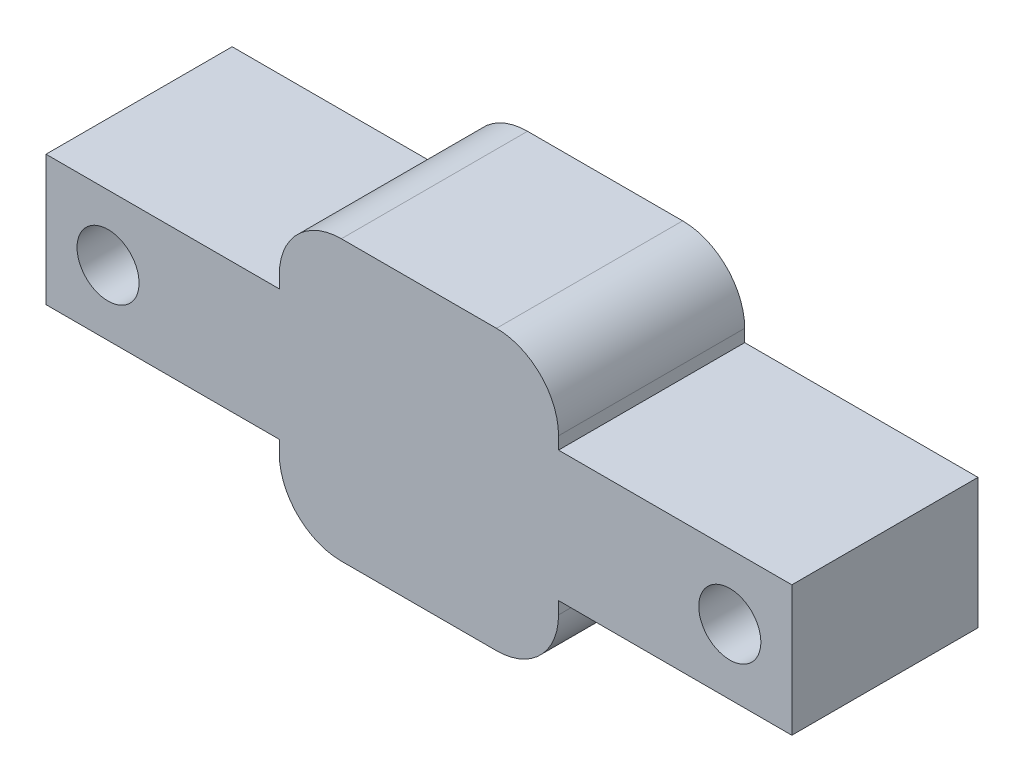
ISO-10303-21;
HEADER;
FILE_DESCRIPTION(('STEP AP214'),'2;1');
FILE_NAME('part.step','',(''),(''),'','','');
FILE_SCHEMA(('AUTOMOTIVE_DESIGN { 1 0 10303 214 1 1 1 1 }'));
ENDSEC;
DATA;
#1=APPLICATION_CONTEXT('core data for automotive mechanical design processes');
#2=APPLICATION_PROTOCOL_DEFINITION('international standard','automotive_design',2000,#1);
#3=PRODUCT_CONTEXT('',#1,'mechanical');
#4=PRODUCT('Part','Part','',(#3));
#5=PRODUCT_RELATED_PRODUCT_CATEGORY('part','',(#4));
#6=PRODUCT_DEFINITION_FORMATION('','',#4);
#7=PRODUCT_DEFINITION_CONTEXT('part definition',#1,'design');
#8=PRODUCT_DEFINITION('design','',#6,#7);
#9=PRODUCT_DEFINITION_SHAPE('','',#8);
#10=(LENGTH_UNIT() NAMED_UNIT(*) SI_UNIT(.MILLI.,.METRE.));
#11=(NAMED_UNIT(*) PLANE_ANGLE_UNIT() SI_UNIT($,.RADIAN.));
#12=(NAMED_UNIT(*) SI_UNIT($,.STERADIAN.) SOLID_ANGLE_UNIT());
#13=UNCERTAINTY_MEASURE_WITH_UNIT(LENGTH_MEASURE(1.E-05),#10,'distance_accuracy_value','');
#14=(GEOMETRIC_REPRESENTATION_CONTEXT(3) GLOBAL_UNCERTAINTY_ASSIGNED_CONTEXT((#13)) GLOBAL_UNIT_ASSIGNED_CONTEXT((#10,
#11,#12)) REPRESENTATION_CONTEXT('',''));
#15=CARTESIAN_POINT('',(0.,0.,0.));
#16=DIRECTION('',(0.,0.,1.));
#17=DIRECTION('',(1.,0.,0.));
#18=AXIS2_PLACEMENT_3D('',#15,#16,#17);
#19=CARTESIAN_POINT('',(-31.8135,0.,19.05));
#20=DIRECTION('',(0.,0.,-1.));
#21=DIRECTION('',(-1.,0.,0.));
#22=AXIS2_PLACEMENT_3D('',#19,#20,#21);
#23=CYLINDRICAL_SURFACE('',#22,3.17500000000001);
#24=CARTESIAN_POINT('',(-31.8135,0.,19.05));
#25=DIRECTION('',(0.,0.,1.));
#26=DIRECTION('',(1.,0.,0.));
#27=AXIS2_PLACEMENT_3D('',#24,#25,#26);
#28=CIRCLE('',#27,3.17500000000001);
#29=CARTESIAN_POINT('',(-34.9885,0.,19.05));
#30=VERTEX_POINT('',#29);
#31=EDGE_CURVE('E194',#30,#30,#28,.T.);
#32=CARTESIAN_POINT('',(-31.8135,0.,6.35));
#33=DIRECTION('',(0.,0.,-1.));
#34=DIRECTION('',(-1.,0.,0.));
#35=AXIS2_PLACEMENT_3D('',#32,#33,#34);
#36=CIRCLE('',#35,3.17500000000001);
#37=CARTESIAN_POINT('',(-34.9885,0.,6.35));
#38=VERTEX_POINT('',#37);
#39=EDGE_CURVE('E43',#38,#38,#36,.T.);
#40=CARTESIAN_POINT('',(-34.9885,0.,19.05));
#41=CARTESIAN_POINT('',(-34.9885,0.,18.9177083333333));
#42=CARTESIAN_POINT('',(-34.9885,0.,18.7854166666667));
#43=CARTESIAN_POINT('',(-34.9885,0.,18.5208333333333));
#44=CARTESIAN_POINT('',(-34.9885,0.,18.3885416666667));
#45=CARTESIAN_POINT('',(-34.9885,0.,18.1239583333333));
#46=CARTESIAN_POINT('',(-34.9885,0.,17.9916666666667));
#47=CARTESIAN_POINT('',(-34.9885,0.,17.7270833333333));
#48=CARTESIAN_POINT('',(-34.9885,0.,17.5947916666667));
#49=CARTESIAN_POINT('',(-34.9885,0.,17.3302083333333));
#50=CARTESIAN_POINT('',(-34.9885,0.,17.1979166666667));
#51=CARTESIAN_POINT('',(-34.9885,0.,16.9333333333333));
#52=CARTESIAN_POINT('',(-34.9885,0.,16.8010416666667));
#53=CARTESIAN_POINT('',(-34.9885,0.,16.5364583333333));
#54=CARTESIAN_POINT('',(-34.9885,0.,16.4041666666667));
#55=CARTESIAN_POINT('',(-34.9885,0.,16.1395833333333));
#56=CARTESIAN_POINT('',(-34.9885,0.,16.0072916666667));
#57=CARTESIAN_POINT('',(-34.9885,0.,15.7427083333333));
#58=CARTESIAN_POINT('',(-34.9885,0.,15.6104166666667));
#59=CARTESIAN_POINT('',(-34.9885,0.,15.3458333333333));
#60=CARTESIAN_POINT('',(-34.9885,0.,15.2135416666667));
#61=CARTESIAN_POINT('',(-34.9885,0.,14.9489583333333));
#62=CARTESIAN_POINT('',(-34.9885,0.,14.8166666666667));
#63=CARTESIAN_POINT('',(-34.9885,0.,14.5520833333333));
#64=CARTESIAN_POINT('',(-34.9885,0.,14.4197916666667));
#65=CARTESIAN_POINT('',(-34.9885,0.,14.1552083333333));
#66=CARTESIAN_POINT('',(-34.9885,0.,14.0229166666667));
#67=CARTESIAN_POINT('',(-34.9885,0.,13.7583333333333));
#68=CARTESIAN_POINT('',(-34.9885,0.,13.6260416666667));
#69=CARTESIAN_POINT('',(-34.9885,0.,13.3614583333333));
#70=CARTESIAN_POINT('',(-34.9885,0.,13.2291666666667));
#71=CARTESIAN_POINT('',(-34.9885,0.,12.9645833333333));
#72=CARTESIAN_POINT('',(-34.9885,0.,12.8322916666667));
#73=CARTESIAN_POINT('',(-34.9885,0.,12.5677083333333));
#74=CARTESIAN_POINT('',(-34.9885,0.,12.4354166666667));
#75=CARTESIAN_POINT('',(-34.9885,0.,12.1708333333333));
#76=CARTESIAN_POINT('',(-34.9885,0.,12.0385416666667));
#77=CARTESIAN_POINT('',(-34.9885,0.,11.7739583333333));
#78=CARTESIAN_POINT('',(-34.9885,0.,11.6416666666667));
#79=CARTESIAN_POINT('',(-34.9885,0.,11.3770833333333));
#80=CARTESIAN_POINT('',(-34.9885,0.,11.2447916666667));
#81=CARTESIAN_POINT('',(-34.9885,0.,10.9802083333333));
#82=CARTESIAN_POINT('',(-34.9885,0.,10.8479166666667));
#83=CARTESIAN_POINT('',(-34.9885,0.,10.5833333333333));
#84=CARTESIAN_POINT('',(-34.9885,0.,10.4510416666667));
#85=CARTESIAN_POINT('',(-34.9885,0.,10.1864583333333));
#86=CARTESIAN_POINT('',(-34.9885,0.,10.0541666666667));
#87=CARTESIAN_POINT('',(-34.9885,0.,9.78958333333333));
#88=CARTESIAN_POINT('',(-34.9885,0.,9.65729166666667));
#89=CARTESIAN_POINT('',(-34.9885,0.,9.39270833333333));
#90=CARTESIAN_POINT('',(-34.9885,0.,9.26041666666667));
#91=CARTESIAN_POINT('',(-34.9885,0.,8.99583333333333));
#92=CARTESIAN_POINT('',(-34.9885,0.,8.86354166666667));
#93=CARTESIAN_POINT('',(-34.9885,0.,8.59895833333333));
#94=CARTESIAN_POINT('',(-34.9885,0.,8.46666666666667));
#95=CARTESIAN_POINT('',(-34.9885,0.,8.20208333333333));
#96=CARTESIAN_POINT('',(-34.9885,0.,8.06979166666667));
#97=CARTESIAN_POINT('',(-34.9885,0.,7.80520833333333));
#98=CARTESIAN_POINT('',(-34.9885,0.,7.67291666666667));
#99=CARTESIAN_POINT('',(-34.9885,0.,7.40833333333333));
#100=CARTESIAN_POINT('',(-34.9885,0.,7.27604166666667));
#101=CARTESIAN_POINT('',(-34.9885,0.,7.01145833333333));
#102=CARTESIAN_POINT('',(-34.9885,0.,6.87916666666667));
#103=CARTESIAN_POINT('',(-34.9885,0.,6.61458333333333));
#104=CARTESIAN_POINT('',(-34.9885,0.,6.48229166666667));
#105=CARTESIAN_POINT('',(-34.9885,0.,6.35));
#106=B_SPLINE_CURVE_WITH_KNOTS('',3,(#40,#41,#42,#43,#44,#45,#46,#47,#48,#49,#50,#51,#52,#53,
#54,#55,#56,#57,#58,#59,#60,#61,#62,#63,#64,#65,#66,#67,#68,#69,#70,#71,#72,#73,#74,#75,#76,#77,
#78,#79,#80,#81,#82,#83,#84,#85,#86,#87,#88,#89,#90,#91,#92,#93,#94,#95,#96,#97,#98,#99,#100,
#101,#102,#103,#104,#105),.UNSPECIFIED.,.F.,.F.,(4,2,2,2,2,2,2,2,2,2,2,2,2,2,2,2,2,2,2,2,2,2,2,
2,2,2,2,2,2,2,2,2,4),(0.,0.396874999999998,0.793749999999999,1.190625,1.5875,1.984375,2.38125,
2.778125,3.175,3.571875,3.96875,4.365625,4.7625,5.159375,5.55625,5.953125,6.35,6.746875,7.14375,
7.540625,7.9375,8.334375,8.73125,9.128125,9.525,9.921875,10.31875,10.715625,11.1125,11.509375,
11.90625,12.303125,12.7),.UNSPECIFIED.);
#107=EDGE_CURVE('BSEAM39',#30,#38,#106,.T.);
#108=ORIENTED_EDGE('',*,*,#31,.T.);
#109=ORIENTED_EDGE('',*,*,#39,.T.);
#110=ORIENTED_EDGE('',*,*,#107,.T.);
#111=ORIENTED_EDGE('',*,*,#107,.F.);
#112=EDGE_LOOP('',(#108,#110,#109,#111));
#113=FACE_BOUND('',#112,.T.);
#114=ADVANCED_FACE('F39',(#113),#23,.F.);
#115=CARTESIAN_POINT('',(-14.2875,-14.2875,19.05));
#116=DIRECTION('',(1.,0.,0.));
#117=DIRECTION('',(0.,0.,-1.));
#118=AXIS2_PLACEMENT_3D('',#115,#116,#117);
#119=PLANE('',#118);
#120=DIRECTION('',(0.,-1.,0.));
#121=VECTOR('',#120,1.);
#122=CARTESIAN_POINT('',(-14.2875,-14.2875,0.));
#123=LINE('',#122,#121);
#124=CARTESIAN_POINT('',(-14.2875,7.9375,0.));
#125=VERTEX_POINT('',#124);
#126=CARTESIAN_POINT('',(-14.2875,6.6675,0.));
#127=VERTEX_POINT('',#126);
#128=EDGE_CURVE('E287',#125,#127,#123,.T.);
#129=ORIENTED_EDGE('',*,*,#128,.T.);
#130=DIRECTION('',(0.,0.,1.));
#131=VECTOR('',#130,1.);
#132=CARTESIAN_POINT('',(-14.2875,6.6675,19.05));
#133=LINE('',#132,#131);
#134=CARTESIAN_POINT('',(-14.2875,6.6675,19.05));
#135=VERTEX_POINT('',#134);
#136=EDGE_CURVE('E65',#127,#135,#133,.T.);
#137=ORIENTED_EDGE('',*,*,#136,.T.);
#138=DIRECTION('',(0.,-1.,0.));
#139=VECTOR('',#138,1.);
#140=CARTESIAN_POINT('',(-14.2875,-14.2875,19.05));
#141=LINE('',#140,#139);
#142=CARTESIAN_POINT('',(-14.2875,7.9375,19.05));
#143=VERTEX_POINT('',#142);
#144=EDGE_CURVE('E162',#143,#135,#141,.T.);
#145=ORIENTED_EDGE('',*,*,#144,.F.);
#146=DIRECTION('',(0.,0.,-1.));
#147=VECTOR('',#146,1.);
#148=CARTESIAN_POINT('',(-14.2875,7.9375,19.05));
#149=LINE('',#148,#147);
#150=EDGE_CURVE('E314',#143,#125,#149,.T.);
#151=ORIENTED_EDGE('',*,*,#150,.T.);
#152=EDGE_LOOP('',(#129,#137,#145,#151));
#153=FACE_BOUND('',#152,.T.);
#154=ADVANCED_FACE('F351',(#153),#119,.F.);
#155=CARTESIAN_POINT('',(31.8135,0.,19.05));
#156=DIRECTION('',(0.,0.,-1.));
#157=DIRECTION('',(-1.,0.,0.));
#158=AXIS2_PLACEMENT_3D('',#155,#156,#157);
#159=CYLINDRICAL_SURFACE('',#158,3.17500000000001);
#160=CARTESIAN_POINT('',(31.8135,0.,19.05));
#161=DIRECTION('',(0.,0.,-1.));
#162=DIRECTION('',(-1.,0.,0.));
#163=AXIS2_PLACEMENT_3D('',#160,#161,#162);
#164=CIRCLE('',#163,3.17500000000001);
#165=CARTESIAN_POINT('',(28.6385,0.,19.05));
#166=VERTEX_POINT('',#165);
#167=EDGE_CURVE('E213',#166,#166,#164,.T.);
#168=CARTESIAN_POINT('',(31.8135,0.,6.35));
#169=DIRECTION('',(0.,0.,-1.));
#170=DIRECTION('',(-1.,0.,0.));
#171=AXIS2_PLACEMENT_3D('',#168,#169,#170);
#172=CIRCLE('',#171,3.17500000000001);
#173=CARTESIAN_POINT('',(28.6385,0.,6.35));
#174=VERTEX_POINT('',#173);
#175=EDGE_CURVE('E209',#174,#174,#172,.F.);
#176=CARTESIAN_POINT('',(28.6385,0.,19.05));
#177=CARTESIAN_POINT('',(28.6385,0.,18.9177083333333));
#178=CARTESIAN_POINT('',(28.6385,0.,18.7854166666667));
#179=CARTESIAN_POINT('',(28.6385,0.,18.5208333333333));
#180=CARTESIAN_POINT('',(28.6385,0.,18.3885416666667));
#181=CARTESIAN_POINT('',(28.6385,0.,18.1239583333333));
#182=CARTESIAN_POINT('',(28.6385,0.,17.9916666666667));
#183=CARTESIAN_POINT('',(28.6385,0.,17.7270833333333));
#184=CARTESIAN_POINT('',(28.6385,0.,17.5947916666667));
#185=CARTESIAN_POINT('',(28.6385,0.,17.3302083333333));
#186=CARTESIAN_POINT('',(28.6385,0.,17.1979166666667));
#187=CARTESIAN_POINT('',(28.6385,0.,16.9333333333333));
#188=CARTESIAN_POINT('',(28.6385,0.,16.8010416666667));
#189=CARTESIAN_POINT('',(28.6385,0.,16.5364583333333));
#190=CARTESIAN_POINT('',(28.6385,0.,16.4041666666667));
#191=CARTESIAN_POINT('',(28.6385,0.,16.1395833333333));
#192=CARTESIAN_POINT('',(28.6385,0.,16.0072916666667));
#193=CARTESIAN_POINT('',(28.6385,0.,15.7427083333333));
#194=CARTESIAN_POINT('',(28.6385,0.,15.6104166666667));
#195=CARTESIAN_POINT('',(28.6385,0.,15.3458333333333));
#196=CARTESIAN_POINT('',(28.6385,0.,15.2135416666667));
#197=CARTESIAN_POINT('',(28.6385,0.,14.9489583333333));
#198=CARTESIAN_POINT('',(28.6385,0.,14.8166666666667));
#199=CARTESIAN_POINT('',(28.6385,0.,14.5520833333333));
#200=CARTESIAN_POINT('',(28.6385,0.,14.4197916666667));
#201=CARTESIAN_POINT('',(28.6385,0.,14.1552083333333));
#202=CARTESIAN_POINT('',(28.6385,0.,14.0229166666667));
#203=CARTESIAN_POINT('',(28.6385,0.,13.7583333333333));
#204=CARTESIAN_POINT('',(28.6385,0.,13.6260416666667));
#205=CARTESIAN_POINT('',(28.6385,0.,13.3614583333333));
#206=CARTESIAN_POINT('',(28.6385,0.,13.2291666666667));
#207=CARTESIAN_POINT('',(28.6385,0.,12.9645833333333));
#208=CARTESIAN_POINT('',(28.6385,0.,12.8322916666667));
#209=CARTESIAN_POINT('',(28.6385,0.,12.5677083333333));
#210=CARTESIAN_POINT('',(28.6385,0.,12.4354166666667));
#211=CARTESIAN_POINT('',(28.6385,0.,12.1708333333333));
#212=CARTESIAN_POINT('',(28.6385,0.,12.0385416666667));
#213=CARTESIAN_POINT('',(28.6385,0.,11.7739583333333));
#214=CARTESIAN_POINT('',(28.6385,0.,11.6416666666667));
#215=CARTESIAN_POINT('',(28.6385,0.,11.3770833333333));
#216=CARTESIAN_POINT('',(28.6385,0.,11.2447916666667));
#217=CARTESIAN_POINT('',(28.6385,0.,10.9802083333333));
#218=CARTESIAN_POINT('',(28.6385,0.,10.8479166666667));
#219=CARTESIAN_POINT('',(28.6385,0.,10.5833333333333));
#220=CARTESIAN_POINT('',(28.6385,0.,10.4510416666667));
#221=CARTESIAN_POINT('',(28.6385,0.,10.1864583333333));
#222=CARTESIAN_POINT('',(28.6385,0.,10.0541666666667));
#223=CARTESIAN_POINT('',(28.6385,0.,9.78958333333333));
#224=CARTESIAN_POINT('',(28.6385,0.,9.65729166666667));
#225=CARTESIAN_POINT('',(28.6385,0.,9.39270833333333));
#226=CARTESIAN_POINT('',(28.6385,0.,9.26041666666667));
#227=CARTESIAN_POINT('',(28.6385,0.,8.99583333333334));
#228=CARTESIAN_POINT('',(28.6385,0.,8.86354166666667));
#229=CARTESIAN_POINT('',(28.6385,0.,8.59895833333333));
#230=CARTESIAN_POINT('',(28.6385,0.,8.46666666666667));
#231=CARTESIAN_POINT('',(28.6385,0.,8.20208333333333));
#232=CARTESIAN_POINT('',(28.6385,0.,8.06979166666667));
#233=CARTESIAN_POINT('',(28.6385,0.,7.80520833333333));
#234=CARTESIAN_POINT('',(28.6385,0.,7.67291666666667));
#235=CARTESIAN_POINT('',(28.6385,0.,7.40833333333333));
#236=CARTESIAN_POINT('',(28.6385,0.,7.27604166666667));
#237=CARTESIAN_POINT('',(28.6385,0.,7.01145833333333));
#238=CARTESIAN_POINT('',(28.6385,0.,6.87916666666667));
#239=CARTESIAN_POINT('',(28.6385,0.,6.61458333333333));
#240=CARTESIAN_POINT('',(28.6385,0.,6.48229166666667));
#241=CARTESIAN_POINT('',(28.6385,0.,6.35));
#242=B_SPLINE_CURVE_WITH_KNOTS('',3,(#176,#177,#178,#179,#180,#181,#182,#183,#184,#185,#186,
#187,#188,#189,#190,#191,#192,#193,#194,#195,#196,#197,#198,#199,#200,#201,#202,#203,#204,#205,
#206,#207,#208,#209,#210,#211,#212,#213,#214,#215,#216,#217,#218,#219,#220,#221,#222,#223,#224,
#225,#226,#227,#228,#229,#230,#231,#232,#233,#234,#235,#236,#237,#238,#239,#240,#241),
.UNSPECIFIED.,.F.,.F.,(4,2,2,2,2,2,2,2,2,2,2,2,2,2,2,2,2,2,2,2,2,2,2,2,2,2,2,2,2,2,2,2,4),(0.,
0.396875000000001,0.793750000000003,1.190625,1.5875,1.984375,2.38125,2.778125,3.175,3.571875,
3.96875,4.365625,4.7625,5.159375,5.55625,5.953125,6.35,6.746875,7.14375,7.540625,7.9375,
8.334375,8.73125,9.128125,9.525,9.921875,10.31875,10.715625,11.1125,11.509375,11.90625,
12.303125,12.7),.UNSPECIFIED.);
#243=EDGE_CURVE('BSEAM348',#166,#174,#242,.T.);
#244=ORIENTED_EDGE('',*,*,#167,.F.);
#245=ORIENTED_EDGE('',*,*,#175,.F.);
#246=ORIENTED_EDGE('',*,*,#243,.T.);
#247=ORIENTED_EDGE('',*,*,#243,.F.);
#248=EDGE_LOOP('',(#244,#246,#245,#247));
#249=FACE_BOUND('',#248,.T.);
#250=ADVANCED_FACE('F348',(#249),#159,.F.);
#251=CARTESIAN_POINT('',(14.2875,-14.2875,19.05));
#252=DIRECTION('',(-1.,0.,0.));
#253=DIRECTION('',(0.,0.,1.));
#254=AXIS2_PLACEMENT_3D('',#251,#252,#253);
#255=PLANE('',#254);
#256=DIRECTION('',(0.,0.,-1.));
#257=VECTOR('',#256,1.);
#258=CARTESIAN_POINT('',(14.2875,-6.6675,19.05));
#259=LINE('',#258,#257);
#260=CARTESIAN_POINT('',(14.2875,-6.6675,19.05));
#261=VERTEX_POINT('',#260);
#262=CARTESIAN_POINT('',(14.2875,-6.6675,0.));
#263=VERTEX_POINT('',#262);
#264=EDGE_CURVE('E217',#261,#263,#259,.T.);
#265=ORIENTED_EDGE('',*,*,#264,.F.);
#266=DIRECTION('',(0.,1.,0.));
#267=VECTOR('',#266,1.);
#268=CARTESIAN_POINT('',(14.2875,-14.2875,19.05));
#269=LINE('',#268,#267);
#270=CARTESIAN_POINT('',(14.2875,-7.9375,19.05));
#271=VERTEX_POINT('',#270);
#272=EDGE_CURVE('E263',#271,#261,#269,.T.);
#273=ORIENTED_EDGE('',*,*,#272,.F.);
#274=DIRECTION('',(0.,0.,-1.));
#275=VECTOR('',#274,1.);
#276=CARTESIAN_POINT('',(14.2875,-7.9375,19.05));
#277=LINE('',#276,#275);
#278=CARTESIAN_POINT('',(14.2875,-7.9375,0.));
#279=VERTEX_POINT('',#278);
#280=EDGE_CURVE('E11',#271,#279,#277,.T.);
#281=ORIENTED_EDGE('',*,*,#280,.T.);
#282=DIRECTION('',(0.,1.,0.));
#283=VECTOR('',#282,1.);
#284=CARTESIAN_POINT('',(14.2875,-14.2875,0.));
#285=LINE('',#284,#283);
#286=EDGE_CURVE('E279',#279,#263,#285,.T.);
#287=ORIENTED_EDGE('',*,*,#286,.T.);
#288=EDGE_LOOP('',(#265,#273,#281,#287));
#289=FACE_BOUND('',#288,.T.);
#290=ADVANCED_FACE('F350',(#289),#255,.F.);
#291=DIRECTION('',(0.,0.,1.));
#292=VECTOR('',#291,1.);
#293=CARTESIAN_POINT('',(14.2875,6.6675,19.05));
#294=LINE('',#293,#292);
#295=CARTESIAN_POINT('',(14.2875,6.6675,0.));
#296=VERTEX_POINT('',#295);
#297=CARTESIAN_POINT('',(14.2875,6.6675,19.05));
#298=VERTEX_POINT('',#297);
#299=EDGE_CURVE('E223',#296,#298,#294,.T.);
#300=ORIENTED_EDGE('',*,*,#299,.F.);
#301=CARTESIAN_POINT('',(14.2875,7.9375,0.));
#302=VERTEX_POINT('',#301);
#303=EDGE_CURVE('E259',#296,#302,#285,.T.);
#304=ORIENTED_EDGE('',*,*,#303,.T.);
#305=DIRECTION('',(0.,0.,-1.));
#306=VECTOR('',#305,1.);
#307=CARTESIAN_POINT('',(14.2875,7.9375,19.05));
#308=LINE('',#307,#306);
#309=CARTESIAN_POINT('',(14.2875,7.9375,19.05));
#310=VERTEX_POINT('',#309);
#311=EDGE_CURVE('E49',#302,#310,#308,.F.);
#312=ORIENTED_EDGE('',*,*,#311,.T.);
#313=EDGE_CURVE('E268',#298,#310,#269,.T.);
#314=ORIENTED_EDGE('',*,*,#313,.F.);
#315=EDGE_LOOP('',(#300,#304,#312,#314));
#316=FACE_BOUND('',#315,.T.);
#317=ADVANCED_FACE('F358',(#316),#255,.F.);
#318=CARTESIAN_POINT('',(-14.2875,14.2875,19.05));
#319=DIRECTION('',(0.,-1.,0.));
#320=DIRECTION('',(0.,0.,-1.));
#321=AXIS2_PLACEMENT_3D('',#318,#319,#320);
#322=PLANE('',#321);
#323=DIRECTION('',(-1.,0.,0.));
#324=VECTOR('',#323,1.);
#325=CARTESIAN_POINT('',(-14.2875,14.2875,0.));
#326=LINE('',#325,#324);
#327=CARTESIAN_POINT('',(7.93749999999999,14.2875,0.));
#328=VERTEX_POINT('',#327);
#329=CARTESIAN_POINT('',(-7.93750000000001,14.2875,0.));
#330=VERTEX_POINT('',#329);
#331=EDGE_CURVE('E282',#328,#330,#326,.T.);
#332=ORIENTED_EDGE('',*,*,#331,.T.);
#333=DIRECTION('',(0.,0.,-1.));
#334=VECTOR('',#333,1.);
#335=CARTESIAN_POINT('',(-7.93750000000001,14.2875,19.05));
#336=LINE('',#335,#334);
#337=CARTESIAN_POINT('',(-7.93750000000001,14.2875,19.05));
#338=VERTEX_POINT('',#337);
#339=EDGE_CURVE('E337',#330,#338,#336,.F.);
#340=ORIENTED_EDGE('',*,*,#339,.T.);
#341=DIRECTION('',(-1.,0.,0.));
#342=VECTOR('',#341,1.);
#343=CARTESIAN_POINT('',(-14.2875,14.2875,19.05));
#344=LINE('',#343,#342);
#345=CARTESIAN_POINT('',(7.93749999999999,14.2875,19.05));
#346=VERTEX_POINT('',#345);
#347=EDGE_CURVE('E267',#346,#338,#344,.T.);
#348=ORIENTED_EDGE('',*,*,#347,.F.);
#349=DIRECTION('',(0.,0.,-1.));
#350=VECTOR('',#349,1.);
#351=CARTESIAN_POINT('',(7.93749999999999,14.2875,19.05));
#352=LINE('',#351,#350);
#353=EDGE_CURVE('E333',#346,#328,#352,.T.);
#354=ORIENTED_EDGE('',*,*,#353,.T.);
#355=EDGE_LOOP('',(#332,#340,#348,#354));
#356=FACE_BOUND('',#355,.T.);
#357=ADVANCED_FACE('F468',(#356),#322,.F.);
#358=CARTESIAN_POINT('',(-14.2875,-6.6675,19.05));
#359=VERTEX_POINT('',#358);
#360=CARTESIAN_POINT('',(-14.2875,-7.9375,19.05));
#361=VERTEX_POINT('',#360);
#362=EDGE_CURVE('E57',#359,#361,#141,.T.);
#363=ORIENTED_EDGE('',*,*,#362,.F.);
#364=DIRECTION('',(0.,0.,-1.));
#365=VECTOR('',#364,1.);
#366=CARTESIAN_POINT('',(-14.2875,-6.6675,19.05));
#367=LINE('',#366,#365);
#368=CARTESIAN_POINT('',(-14.2875,-6.6675,0.));
#369=VERTEX_POINT('',#368);
#370=EDGE_CURVE('E178',#359,#369,#367,.T.);
#371=ORIENTED_EDGE('',*,*,#370,.T.);
#372=CARTESIAN_POINT('',(-14.2875,-7.9375,0.));
#373=VERTEX_POINT('',#372);
#374=EDGE_CURVE('E286',#369,#373,#123,.T.);
#375=ORIENTED_EDGE('',*,*,#374,.T.);
#376=DIRECTION('',(0.,0.,-1.));
#377=VECTOR('',#376,1.);
#378=CARTESIAN_POINT('',(-14.2875,-7.9375,19.05));
#379=LINE('',#378,#377);
#380=EDGE_CURVE('E318',#373,#361,#379,.F.);
#381=ORIENTED_EDGE('',*,*,#380,.T.);
#382=EDGE_LOOP('',(#363,#371,#375,#381));
#383=FACE_BOUND('',#382,.T.);
#384=ADVANCED_FACE('F362',(#383),#119,.F.);
#385=CARTESIAN_POINT('',(-14.2875,-14.2875,19.05));
#386=DIRECTION('',(0.,1.,0.));
#387=DIRECTION('',(0.,0.,1.));
#388=AXIS2_PLACEMENT_3D('',#385,#386,#387);
#389=PLANE('',#388);
#390=DIRECTION('',(1.,0.,0.));
#391=VECTOR('',#390,1.);
#392=CARTESIAN_POINT('',(-14.2875,-14.2875,19.05));
#393=LINE('',#392,#391);
#394=CARTESIAN_POINT('',(-7.93750000000001,-14.2875,19.05));
#395=VERTEX_POINT('',#394);
#396=CARTESIAN_POINT('',(7.9375,-14.2875,19.05));
#397=VERTEX_POINT('',#396);
#398=EDGE_CURVE('E274',#395,#397,#393,.T.);
#399=ORIENTED_EDGE('',*,*,#398,.F.);
#400=DIRECTION('',(0.,0.,-1.));
#401=VECTOR('',#400,1.);
#402=CARTESIAN_POINT('',(-7.93750000000001,-14.2875,19.05));
#403=LINE('',#402,#401);
#404=CARTESIAN_POINT('',(-7.93750000000001,-14.2875,0.));
#405=VERTEX_POINT('',#404);
#406=EDGE_CURVE('E296',#395,#405,#403,.T.);
#407=ORIENTED_EDGE('',*,*,#406,.T.);
#408=DIRECTION('',(1.,0.,0.));
#409=VECTOR('',#408,1.);
#410=CARTESIAN_POINT('',(-14.2875,-14.2875,0.));
#411=LINE('',#410,#409);
#412=CARTESIAN_POINT('',(7.9375,-14.2875,0.));
#413=VERTEX_POINT('',#412);
#414=EDGE_CURVE('E290',#405,#413,#411,.T.);
#415=ORIENTED_EDGE('',*,*,#414,.T.);
#416=DIRECTION('',(0.,0.,-1.));
#417=VECTOR('',#416,1.);
#418=CARTESIAN_POINT('',(7.9375,-14.2875,19.05));
#419=LINE('',#418,#417);
#420=EDGE_CURVE('E278',#413,#397,#419,.F.);
#421=ORIENTED_EDGE('',*,*,#420,.T.);
#422=EDGE_LOOP('',(#399,#407,#415,#421));
#423=FACE_BOUND('',#422,.T.);
#424=ADVANCED_FACE('F411',(#423),#389,.F.);
#425=CARTESIAN_POINT('',(0.,0.,19.05));
#426=DIRECTION('',(0.,0.,-1.));
#427=DIRECTION('',(-1.,0.,0.));
#428=AXIS2_PLACEMENT_3D('',#425,#426,#427);
#429=PLANE('',#428);
#430=ORIENTED_EDGE('',*,*,#31,.F.);
#431=EDGE_LOOP('',(#430));
#432=FACE_BOUND('',#431,.T.);
#433=ORIENTED_EDGE('',*,*,#167,.T.);
#434=EDGE_LOOP('',(#433));
#435=FACE_BOUND('',#434,.T.);
#436=ORIENTED_EDGE('',*,*,#144,.T.);
#437=DIRECTION('',(1.,0.,0.));
#438=VECTOR('',#437,1.);
#439=CARTESIAN_POINT('',(-38.1635,6.6675,19.05));
#440=LINE('',#439,#438);
#441=CARTESIAN_POINT('',(-38.1635,6.6675,19.05));
#442=VERTEX_POINT('',#441);
#443=EDGE_CURVE('E157',#442,#135,#440,.T.);
#444=ORIENTED_EDGE('',*,*,#443,.F.);
#445=DIRECTION('',(0.,-1.,0.));
#446=VECTOR('',#445,1.);
#447=CARTESIAN_POINT('',(-38.1635,6.6675,19.05));
#448=LINE('',#447,#446);
#449=CARTESIAN_POINT('',(-38.1635,-6.6675,19.05));
#450=VERTEX_POINT('',#449);
#451=EDGE_CURVE('E160',#442,#450,#448,.T.);
#452=ORIENTED_EDGE('',*,*,#451,.T.);
#453=DIRECTION('',(1.,0.,0.));
#454=VECTOR('',#453,1.);
#455=CARTESIAN_POINT('',(-38.1635,-6.6675,19.05));
#456=LINE('',#455,#454);
#457=EDGE_CURVE('E191',#450,#359,#456,.T.);
#458=ORIENTED_EDGE('',*,*,#457,.T.);
#459=ORIENTED_EDGE('',*,*,#362,.T.);
#460=CARTESIAN_POINT('',(-7.93750000000001,-7.9375,19.05));
#461=DIRECTION('',(0.,0.,-1.));
#462=DIRECTION('',(-1.,0.,0.));
#463=AXIS2_PLACEMENT_3D('',#460,#461,#462);
#464=CIRCLE('',#463,6.35);
#465=EDGE_CURVE('E330',#361,#395,#464,.F.);
#466=ORIENTED_EDGE('',*,*,#465,.T.);
#467=ORIENTED_EDGE('',*,*,#398,.T.);
#468=CARTESIAN_POINT('',(7.9375,-7.9375,19.05));
#469=DIRECTION('',(0.,0.,-1.));
#470=DIRECTION('',(-1.,0.,0.));
#471=AXIS2_PLACEMENT_3D('',#468,#469,#470);
#472=CIRCLE('',#471,6.35);
#473=EDGE_CURVE('E324',#397,#271,#472,.F.);
#474=ORIENTED_EDGE('',*,*,#473,.T.);
#475=ORIENTED_EDGE('',*,*,#272,.T.);
#476=DIRECTION('',(-1.,0.,0.));
#477=VECTOR('',#476,1.);
#478=CARTESIAN_POINT('',(38.1635,-6.6675,19.05));
#479=LINE('',#478,#477);
#480=CARTESIAN_POINT('',(38.1635,-6.6675,19.05));
#481=VERTEX_POINT('',#480);
#482=EDGE_CURVE('E250',#481,#261,#479,.T.);
#483=ORIENTED_EDGE('',*,*,#482,.F.);
#484=DIRECTION('',(0.,-1.,0.));
#485=VECTOR('',#484,1.);
#486=CARTESIAN_POINT('',(38.1635,6.6675,19.05));
#487=LINE('',#486,#485);
#488=CARTESIAN_POINT('',(38.1635,6.6675,19.05));
#489=VERTEX_POINT('',#488);
#490=EDGE_CURVE('E218',#489,#481,#487,.T.);
#491=ORIENTED_EDGE('',*,*,#490,.F.);
#492=DIRECTION('',(-1.,0.,0.));
#493=VECTOR('',#492,1.);
#494=CARTESIAN_POINT('',(38.1635,6.6675,19.05));
#495=LINE('',#494,#493);
#496=EDGE_CURVE('E232',#489,#298,#495,.T.);
#497=ORIENTED_EDGE('',*,*,#496,.T.);
#498=ORIENTED_EDGE('',*,*,#313,.T.);
#499=CARTESIAN_POINT('',(7.93749999999999,7.9375,19.05));
#500=DIRECTION('',(0.,0.,-1.));
#501=DIRECTION('',(-1.,0.,0.));
#502=AXIS2_PLACEMENT_3D('',#499,#500,#501);
#503=CIRCLE('',#502,6.35);
#504=EDGE_CURVE('E321',#310,#346,#503,.F.);
#505=ORIENTED_EDGE('',*,*,#504,.T.);
#506=ORIENTED_EDGE('',*,*,#347,.T.);
#507=CARTESIAN_POINT('',(-7.93750000000001,7.9375,19.05));
#508=DIRECTION('',(0.,0.,-1.));
#509=DIRECTION('',(-1.,0.,0.));
#510=AXIS2_PLACEMENT_3D('',#507,#508,#509);
#511=CIRCLE('',#510,6.35);
#512=EDGE_CURVE('E327',#338,#143,#511,.F.);
#513=ORIENTED_EDGE('',*,*,#512,.T.);
#514=EDGE_LOOP('',(#436,#444,#452,#458,#459,#466,#467,#474,#475,#483,#491,#497,#498,#505,#506,#513));
#515=FACE_BOUND('',#514,.T.);
#516=ADVANCED_FACE('F159',(#432,#435,#515),#429,.F.);
#517=CARTESIAN_POINT('',(0.,0.,0.));
#518=DIRECTION('',(0.,0.,-1.));
#519=DIRECTION('',(-1.,0.,0.));
#520=AXIS2_PLACEMENT_3D('',#517,#518,#519);
#521=PLANE('',#520);
#522=CARTESIAN_POINT('',(-31.8135,0.,0.));
#523=DIRECTION('',(0.,0.,1.));
#524=DIRECTION('',(1.,0.,0.));
#525=AXIS2_PLACEMENT_3D('',#522,#523,#524);
#526=CIRCLE('',#525,4.7625);
#527=CARTESIAN_POINT('',(-27.051,0.,0.));
#528=VERTEX_POINT('',#527);
#529=EDGE_CURVE('E581',#528,#528,#526,.T.);
#530=ORIENTED_EDGE('',*,*,#529,.T.);
#531=EDGE_LOOP('',(#530));
#532=FACE_BOUND('',#531,.T.);
#533=CARTESIAN_POINT('',(31.8135,0.,0.));
#534=DIRECTION('',(0.,0.,-1.));
#535=DIRECTION('',(-1.,0.,0.));
#536=AXIS2_PLACEMENT_3D('',#533,#534,#535);
#537=CIRCLE('',#536,4.7625);
#538=CARTESIAN_POINT('',(27.051,0.,0.));
#539=VERTEX_POINT('',#538);
#540=EDGE_CURVE('E166',#539,#539,#537,.T.);
#541=ORIENTED_EDGE('',*,*,#540,.F.);
#542=EDGE_LOOP('',(#541));
#543=FACE_BOUND('',#542,.T.);
#544=CARTESIAN_POINT('',(0.,0.,0.));
#545=DIRECTION('',(0.,0.,1.));
#546=DIRECTION('',(1.,0.,0.));
#547=AXIS2_PLACEMENT_3D('',#544,#545,#546);
#548=CIRCLE('',#547,13.335);
#549=CARTESIAN_POINT('',(13.335,0.,0.));
#550=VERTEX_POINT('',#549);
#551=EDGE_CURVE('E254',#550,#550,#548,.T.);
#552=ORIENTED_EDGE('',*,*,#551,.T.);
#553=EDGE_LOOP('',(#552));
#554=FACE_BOUND('',#553,.T.);
#555=ORIENTED_EDGE('',*,*,#414,.F.);
#556=CARTESIAN_POINT('',(-7.93750000000001,-7.9375,0.));
#557=DIRECTION('',(0.,0.,-1.));
#558=DIRECTION('',(-1.,0.,0.));
#559=AXIS2_PLACEMENT_3D('',#556,#557,#558);
#560=CIRCLE('',#559,6.35);
#561=EDGE_CURVE('E310',#405,#373,#560,.T.);
#562=ORIENTED_EDGE('',*,*,#561,.T.);
#563=ORIENTED_EDGE('',*,*,#374,.F.);
#564=DIRECTION('',(1.,0.,0.));
#565=VECTOR('',#564,1.);
#566=CARTESIAN_POINT('',(-38.1635,-6.6675,0.));
#567=LINE('',#566,#565);
#568=CARTESIAN_POINT('',(-38.1635,-6.6675,0.));
#569=VERTEX_POINT('',#568);
#570=EDGE_CURVE('E199',#569,#369,#567,.T.);
#571=ORIENTED_EDGE('',*,*,#570,.F.);
#572=DIRECTION('',(0.,1.,0.));
#573=VECTOR('',#572,1.);
#574=CARTESIAN_POINT('',(-38.1635,6.6675,0.));
#575=LINE('',#574,#573);
#576=CARTESIAN_POINT('',(-38.1635,6.6675,0.));
#577=VERTEX_POINT('',#576);
#578=EDGE_CURVE('E183',#569,#577,#575,.T.);
#579=ORIENTED_EDGE('',*,*,#578,.T.);
#580=DIRECTION('',(1.,0.,0.));
#581=VECTOR('',#580,1.);
#582=CARTESIAN_POINT('',(-38.1635,6.6675,0.));
#583=LINE('',#582,#581);
#584=EDGE_CURVE('E167',#577,#127,#583,.T.);
#585=ORIENTED_EDGE('',*,*,#584,.T.);
#586=ORIENTED_EDGE('',*,*,#128,.F.);
#587=CARTESIAN_POINT('',(-7.93750000000001,7.9375,0.));
#588=DIRECTION('',(0.,0.,-1.));
#589=DIRECTION('',(-1.,0.,0.));
#590=AXIS2_PLACEMENT_3D('',#587,#588,#589);
#591=CIRCLE('',#590,6.35);
#592=EDGE_CURVE('E307',#125,#330,#591,.T.);
#593=ORIENTED_EDGE('',*,*,#592,.T.);
#594=ORIENTED_EDGE('',*,*,#331,.F.);
#595=CARTESIAN_POINT('',(7.93749999999999,7.9375,0.));
#596=DIRECTION('',(0.,0.,-1.));
#597=DIRECTION('',(-1.,0.,0.));
#598=AXIS2_PLACEMENT_3D('',#595,#596,#597);
#599=CIRCLE('',#598,6.35);
#600=EDGE_CURVE('E300',#328,#302,#599,.T.);
#601=ORIENTED_EDGE('',*,*,#600,.T.);
#602=ORIENTED_EDGE('',*,*,#303,.F.);
#603=DIRECTION('',(-1.,0.,0.));
#604=VECTOR('',#603,1.);
#605=CARTESIAN_POINT('',(38.1635,6.6675,0.));
#606=LINE('',#605,#604);
#607=CARTESIAN_POINT('',(38.1635,6.6675,0.));
#608=VERTEX_POINT('',#607);
#609=EDGE_CURVE('E242',#608,#296,#606,.T.);
#610=ORIENTED_EDGE('',*,*,#609,.F.);
#611=DIRECTION('',(0.,1.,0.));
#612=VECTOR('',#611,1.);
#613=CARTESIAN_POINT('',(38.1635,6.6675,0.));
#614=LINE('',#613,#612);
#615=CARTESIAN_POINT('',(38.1635,-6.6675,0.));
#616=VERTEX_POINT('',#615);
#617=EDGE_CURVE('E226',#616,#608,#614,.T.);
#618=ORIENTED_EDGE('',*,*,#617,.F.);
#619=DIRECTION('',(-1.,0.,0.));
#620=VECTOR('',#619,1.);
#621=CARTESIAN_POINT('',(38.1635,-6.6675,0.));
#622=LINE('',#621,#620);
#623=EDGE_CURVE('E246',#616,#263,#622,.T.);
#624=ORIENTED_EDGE('',*,*,#623,.T.);
#625=ORIENTED_EDGE('',*,*,#286,.F.);
#626=CARTESIAN_POINT('',(7.9375,-7.9375,0.));
#627=DIRECTION('',(0.,0.,-1.));
#628=DIRECTION('',(-1.,0.,0.));
#629=AXIS2_PLACEMENT_3D('',#626,#627,#628);
#630=CIRCLE('',#629,6.35);
#631=EDGE_CURVE('E304',#279,#413,#630,.T.);
#632=ORIENTED_EDGE('',*,*,#631,.T.);
#633=EDGE_LOOP('',(#555,#562,#563,#571,#579,#585,#586,#593,#594,#601,#602,#610,#618,#624,#625,#632));
#634=FACE_BOUND('',#633,.T.);
#635=ADVANCED_FACE('F397',(#532,#543,#554,#634),#521,.T.);
#636=CARTESIAN_POINT('',(0.,0.,1.5875));
#637=DIRECTION('',(0.,0.,-1.));
#638=DIRECTION('',(-1.,0.,0.));
#639=AXIS2_PLACEMENT_3D('',#636,#637,#638);
#640=CYLINDRICAL_SURFACE('',#639,13.335);
#641=CARTESIAN_POINT('',(0.,0.,1.5875));
#642=DIRECTION('',(0.,0.,1.));
#643=DIRECTION('',(1.,0.,0.));
#644=AXIS2_PLACEMENT_3D('',#641,#642,#643);
#645=CIRCLE('',#644,13.335);
#646=CARTESIAN_POINT('',(13.335,0.,1.5875));
#647=VERTEX_POINT('',#646);
#648=EDGE_CURVE('E255',#647,#647,#645,.T.);
#649=ORIENTED_EDGE('',*,*,#648,.T.);
#650=EDGE_LOOP('',(#649));
#651=FACE_BOUND('',#650,.T.);
#652=ORIENTED_EDGE('',*,*,#551,.F.);
#653=EDGE_LOOP('',(#652));
#654=FACE_BOUND('',#653,.T.);
#655=ADVANCED_FACE('F400',(#651,#654),#640,.F.);
#656=CARTESIAN_POINT('',(0.,0.,1.5875));
#657=DIRECTION('',(0.,0.,1.));
#658=DIRECTION('',(1.,0.,0.));
#659=AXIS2_PLACEMENT_3D('',#656,#657,#658);
#660=PLANE('',#659);
#661=ORIENTED_EDGE('',*,*,#648,.F.);
#662=EDGE_LOOP('',(#661));
#663=FACE_BOUND('',#662,.T.);
#664=ADVANCED_FACE('F444',(#663),#660,.F.);
#665=CARTESIAN_POINT('',(-7.93750000000001,-7.9375,19.05));
#666=DIRECTION('',(0.,0.,-1.));
#667=DIRECTION('',(-1.,0.,0.));
#668=AXIS2_PLACEMENT_3D('',#665,#666,#667);
#669=CYLINDRICAL_SURFACE('',#668,6.35);
#670=ORIENTED_EDGE('',*,*,#465,.F.);
#671=ORIENTED_EDGE('',*,*,#380,.F.);
#672=ORIENTED_EDGE('',*,*,#561,.F.);
#673=ORIENTED_EDGE('',*,*,#406,.F.);
#674=EDGE_LOOP('',(#670,#671,#672,#673));
#675=FACE_BOUND('',#674,.T.);
#676=ADVANCED_FACE('F441',(#675),#669,.T.);
#677=CARTESIAN_POINT('',(-7.93750000000001,7.9375,19.05));
#678=DIRECTION('',(0.,0.,-1.));
#679=DIRECTION('',(-1.,0.,0.));
#680=AXIS2_PLACEMENT_3D('',#677,#678,#679);
#681=CYLINDRICAL_SURFACE('',#680,6.35);
#682=ORIENTED_EDGE('',*,*,#512,.F.);
#683=ORIENTED_EDGE('',*,*,#339,.F.);
#684=ORIENTED_EDGE('',*,*,#592,.F.);
#685=ORIENTED_EDGE('',*,*,#150,.F.);
#686=EDGE_LOOP('',(#682,#683,#684,#685));
#687=FACE_BOUND('',#686,.T.);
#688=ADVANCED_FACE('F443',(#687),#681,.T.);
#689=CARTESIAN_POINT('',(7.9375,-7.9375,19.05));
#690=DIRECTION('',(0.,0.,-1.));
#691=DIRECTION('',(-1.,0.,0.));
#692=AXIS2_PLACEMENT_3D('',#689,#690,#691);
#693=CYLINDRICAL_SURFACE('',#692,6.35);
#694=ORIENTED_EDGE('',*,*,#473,.F.);
#695=ORIENTED_EDGE('',*,*,#420,.F.);
#696=ORIENTED_EDGE('',*,*,#631,.F.);
#697=ORIENTED_EDGE('',*,*,#280,.F.);
#698=EDGE_LOOP('',(#694,#695,#696,#697));
#699=FACE_BOUND('',#698,.T.);
#700=ADVANCED_FACE('F415',(#699),#693,.T.);
#701=CARTESIAN_POINT('',(7.93749999999999,7.9375,19.05));
#702=DIRECTION('',(0.,0.,-1.));
#703=DIRECTION('',(-1.,0.,0.));
#704=AXIS2_PLACEMENT_3D('',#701,#702,#703);
#705=CYLINDRICAL_SURFACE('',#704,6.35);
#706=ORIENTED_EDGE('',*,*,#504,.F.);
#707=ORIENTED_EDGE('',*,*,#311,.F.);
#708=ORIENTED_EDGE('',*,*,#600,.F.);
#709=ORIENTED_EDGE('',*,*,#353,.F.);
#710=EDGE_LOOP('',(#706,#707,#708,#709));
#711=FACE_BOUND('',#710,.T.);
#712=ADVANCED_FACE('F41',(#711),#705,.T.);
#713=CARTESIAN_POINT('',(38.1635,-6.6675,19.05));
#714=DIRECTION('',(0.,1.,0.));
#715=DIRECTION('',(0.,0.,1.));
#716=AXIS2_PLACEMENT_3D('',#713,#714,#715);
#717=PLANE('',#716);
#718=ORIENTED_EDGE('',*,*,#264,.T.);
#719=ORIENTED_EDGE('',*,*,#623,.F.);
#720=DIRECTION('',(0.,0.,-1.));
#721=VECTOR('',#720,1.);
#722=CARTESIAN_POINT('',(38.1635,-6.6675,19.05));
#723=LINE('',#722,#721);
#724=EDGE_CURVE('E222',#481,#616,#723,.T.);
#725=ORIENTED_EDGE('',*,*,#724,.F.);
#726=ORIENTED_EDGE('',*,*,#482,.T.);
#727=EDGE_LOOP('',(#718,#719,#725,#726));
#728=FACE_BOUND('',#727,.T.);
#729=ADVANCED_FACE('F421',(#728),#717,.F.);
#730=CARTESIAN_POINT('',(38.1635,6.6675,19.05));
#731=DIRECTION('',(0.,-1.,0.));
#732=DIRECTION('',(0.,0.,-1.));
#733=AXIS2_PLACEMENT_3D('',#730,#731,#732);
#734=PLANE('',#733);
#735=ORIENTED_EDGE('',*,*,#299,.T.);
#736=ORIENTED_EDGE('',*,*,#496,.F.);
#737=DIRECTION('',(0.,0.,1.));
#738=VECTOR('',#737,1.);
#739=CARTESIAN_POINT('',(38.1635,6.6675,19.05));
#740=LINE('',#739,#738);
#741=EDGE_CURVE('E229',#608,#489,#740,.T.);
#742=ORIENTED_EDGE('',*,*,#741,.F.);
#743=ORIENTED_EDGE('',*,*,#609,.T.);
#744=EDGE_LOOP('',(#735,#736,#742,#743));
#745=FACE_BOUND('',#744,.T.);
#746=ADVANCED_FACE('F429',(#745),#734,.F.);
#747=CARTESIAN_POINT('',(38.1635,0.,0.));
#748=DIRECTION('',(1.,0.,0.));
#749=DIRECTION('',(0.,0.,-1.));
#750=AXIS2_PLACEMENT_3D('',#747,#748,#749);
#751=PLANE('',#750);
#752=ORIENTED_EDGE('',*,*,#490,.T.);
#753=ORIENTED_EDGE('',*,*,#724,.T.);
#754=ORIENTED_EDGE('',*,*,#617,.T.);
#755=ORIENTED_EDGE('',*,*,#741,.T.);
#756=EDGE_LOOP('',(#752,#753,#754,#755));
#757=FACE_BOUND('',#756,.T.);
#758=ADVANCED_FACE('F387',(#757),#751,.T.);
#759=CARTESIAN_POINT('',(31.8135,0.,6.35));
#760=DIRECTION('',(0.,0.,-1.));
#761=DIRECTION('',(-1.,0.,0.));
#762=AXIS2_PLACEMENT_3D('',#759,#760,#761);
#763=PLANE('',#762);
#764=CARTESIAN_POINT('',(31.8135,0.,6.35));
#765=DIRECTION('',(0.,0.,-1.));
#766=DIRECTION('',(-1.,0.,0.));
#767=AXIS2_PLACEMENT_3D('',#764,#765,#766);
#768=CIRCLE('',#767,4.7625);
#769=CARTESIAN_POINT('',(27.051,0.,6.35));
#770=VERTEX_POINT('',#769);
#771=EDGE_CURVE('E205',#770,#770,#768,.T.);
#772=ORIENTED_EDGE('',*,*,#771,.T.);
#773=EDGE_LOOP('',(#772));
#774=FACE_BOUND('',#773,.T.);
#775=ORIENTED_EDGE('',*,*,#175,.T.);
#776=EDGE_LOOP('',(#775));
#777=FACE_BOUND('',#776,.T.);
#778=ADVANCED_FACE('F346',(#774,#777),#763,.T.);
#779=CARTESIAN_POINT('',(31.8135,0.,6.35));
#780=DIRECTION('',(0.,0.,-1.));
#781=DIRECTION('',(-1.,0.,0.));
#782=AXIS2_PLACEMENT_3D('',#779,#780,#781);
#783=CYLINDRICAL_SURFACE('',#782,4.7625);
#784=ORIENTED_EDGE('',*,*,#771,.F.);
#785=EDGE_LOOP('',(#784));
#786=FACE_BOUND('',#785,.T.);
#787=ORIENTED_EDGE('',*,*,#540,.T.);
#788=EDGE_LOOP('',(#787));
#789=FACE_BOUND('',#788,.T.);
#790=ADVANCED_FACE('F385',(#786,#789),#783,.F.);
#791=CARTESIAN_POINT('',(-38.1635,6.6675,19.05));
#792=DIRECTION('',(0.,1.,0.));
#793=DIRECTION('',(0.,0.,1.));
#794=AXIS2_PLACEMENT_3D('',#791,#792,#793);
#795=PLANE('',#794);
#796=ORIENTED_EDGE('',*,*,#136,.F.);
#797=ORIENTED_EDGE('',*,*,#584,.F.);
#798=DIRECTION('',(0.,0.,1.));
#799=VECTOR('',#798,1.);
#800=CARTESIAN_POINT('',(-38.1635,6.6675,19.05));
#801=LINE('',#800,#799);
#802=EDGE_CURVE('E173',#577,#442,#801,.T.);
#803=ORIENTED_EDGE('',*,*,#802,.T.);
#804=ORIENTED_EDGE('',*,*,#443,.T.);
#805=EDGE_LOOP('',(#796,#797,#803,#804));
#806=FACE_BOUND('',#805,.T.);
#807=ADVANCED_FACE('F180',(#806),#795,.T.);
#808=CARTESIAN_POINT('',(-38.1635,-6.6675,19.05));
#809=DIRECTION('',(0.,-1.,0.));
#810=DIRECTION('',(0.,0.,-1.));
#811=AXIS2_PLACEMENT_3D('',#808,#809,#810);
#812=PLANE('',#811);
#813=ORIENTED_EDGE('',*,*,#370,.F.);
#814=ORIENTED_EDGE('',*,*,#457,.F.);
#815=DIRECTION('',(0.,0.,-1.));
#816=VECTOR('',#815,1.);
#817=CARTESIAN_POINT('',(-38.1635,-6.6675,19.05));
#818=LINE('',#817,#816);
#819=EDGE_CURVE('E176',#450,#569,#818,.T.);
#820=ORIENTED_EDGE('',*,*,#819,.T.);
#821=ORIENTED_EDGE('',*,*,#570,.T.);
#822=EDGE_LOOP('',(#813,#814,#820,#821));
#823=FACE_BOUND('',#822,.T.);
#824=ADVANCED_FACE('F379',(#823),#812,.T.);
#825=CARTESIAN_POINT('',(-38.1635,0.,0.));
#826=DIRECTION('',(-1.,0.,0.));
#827=DIRECTION('',(0.,0.,-1.));
#828=AXIS2_PLACEMENT_3D('',#825,#826,#827);
#829=PLANE('',#828);
#830=ORIENTED_EDGE('',*,*,#451,.F.);
#831=ORIENTED_EDGE('',*,*,#802,.F.);
#832=ORIENTED_EDGE('',*,*,#578,.F.);
#833=ORIENTED_EDGE('',*,*,#819,.F.);
#834=EDGE_LOOP('',(#830,#831,#832,#833));
#835=FACE_BOUND('',#834,.T.);
#836=ADVANCED_FACE('F171',(#835),#829,.T.);
#837=CARTESIAN_POINT('',(-31.8135,0.,6.35));
#838=DIRECTION('',(0.,0.,-1.));
#839=DIRECTION('',(-1.,0.,0.));
#840=AXIS2_PLACEMENT_3D('',#837,#838,#839);
#841=CYLINDRICAL_SURFACE('',#840,4.7625);
#842=CARTESIAN_POINT('',(-31.8135,0.,6.35));
#843=DIRECTION('',(0.,0.,1.));
#844=DIRECTION('',(1.,0.,0.));
#845=AXIS2_PLACEMENT_3D('',#842,#843,#844);
#846=CIRCLE('',#845,4.7625);
#847=CARTESIAN_POINT('',(-27.051,0.,6.35));
#848=VERTEX_POINT('',#847);
#849=EDGE_CURVE('E579',#848,#848,#846,.T.);
#850=ORIENTED_EDGE('',*,*,#849,.T.);
#851=EDGE_LOOP('',(#850));
#852=FACE_BOUND('',#851,.T.);
#853=ORIENTED_EDGE('',*,*,#529,.F.);
#854=EDGE_LOOP('',(#853));
#855=FACE_BOUND('',#854,.T.);
#856=ADVANCED_FACE('F375',(#852,#855),#841,.F.);
#857=CARTESIAN_POINT('',(-31.8135,0.,6.35));
#858=DIRECTION('',(0.,0.,-1.));
#859=DIRECTION('',(1.,0.,0.));
#860=AXIS2_PLACEMENT_3D('',#857,#858,#859);
#861=PLANE('',#860);
#862=ORIENTED_EDGE('',*,*,#39,.F.);
#863=EDGE_LOOP('',(#862));
#864=FACE_BOUND('',#863,.T.);
#865=ORIENTED_EDGE('',*,*,#849,.F.);
#866=EDGE_LOOP('',(#865));
#867=FACE_BOUND('',#866,.T.);
#868=ADVANCED_FACE('F562',(#864,#867),#861,.T.);
#869=CLOSED_SHELL('',(#114,#154,#250,#290,#317,#357,#384,#424,#516,#635,#655,#664,#676,#688,
#700,#712,#729,#746,#758,#778,#790,#807,#824,#836,#856,#868));
#870=MANIFOLD_SOLID_BREP('B2',#869);
#871=ADVANCED_BREP_SHAPE_REPRESENTATION('',(#18,#870),#14);
#872=SHAPE_DEFINITION_REPRESENTATION(#9,#871);
ENDSEC;
END-ISO-10303-21;
